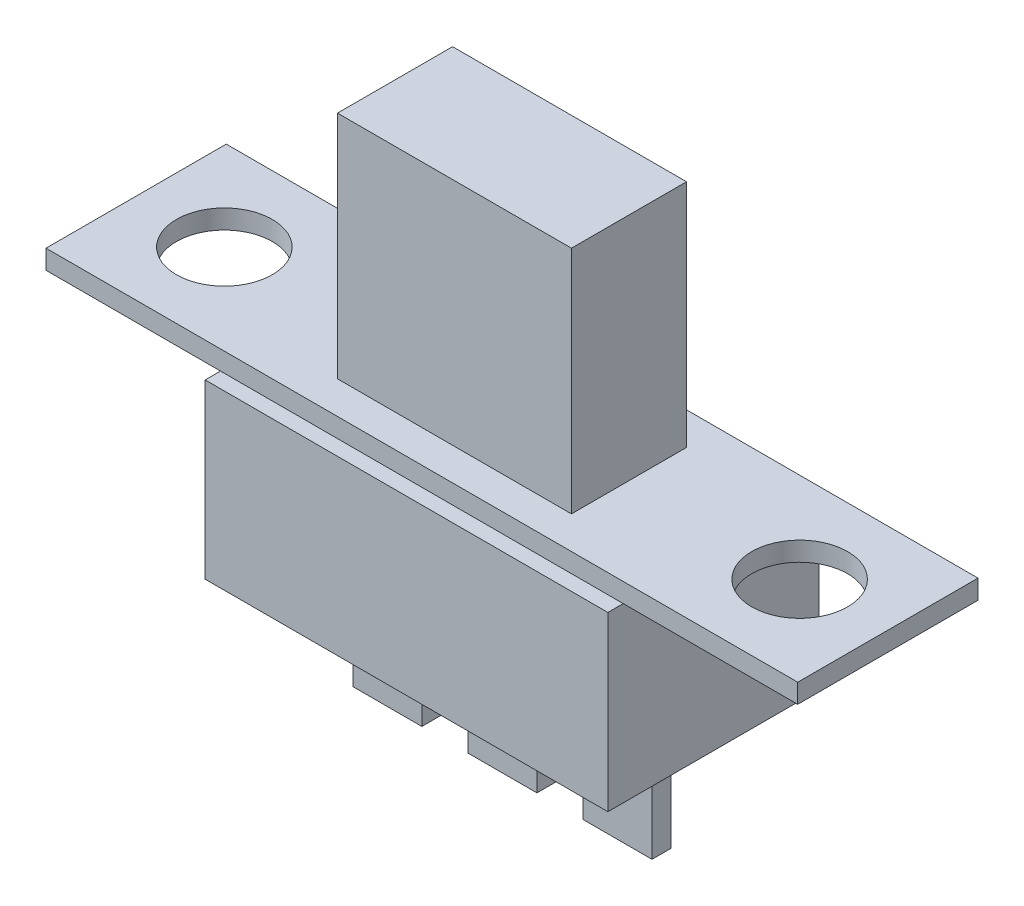
ISO-10303-21;
HEADER;
FILE_DESCRIPTION(('STEP AP214'),'2;1');
FILE_NAME('part.step','',(''),(''),'','','');
FILE_SCHEMA(('AUTOMOTIVE_DESIGN { 1 0 10303 214 1 1 1 1 }'));
ENDSEC;
DATA;
#1=APPLICATION_CONTEXT('core data for automotive mechanical design processes');
#2=APPLICATION_PROTOCOL_DEFINITION('international standard','automotive_design',2000,#1);
#3=PRODUCT_CONTEXT('',#1,'mechanical');
#4=PRODUCT('Part','Part','',(#3));
#5=PRODUCT_RELATED_PRODUCT_CATEGORY('part','',(#4));
#6=PRODUCT_DEFINITION_FORMATION('','',#4);
#7=PRODUCT_DEFINITION_CONTEXT('part definition',#1,'design');
#8=PRODUCT_DEFINITION('design','',#6,#7);
#9=PRODUCT_DEFINITION_SHAPE('','',#8);
#10=(LENGTH_UNIT() NAMED_UNIT(*) SI_UNIT(.MILLI.,.METRE.));
#11=(NAMED_UNIT(*) PLANE_ANGLE_UNIT() SI_UNIT($,.RADIAN.));
#12=(NAMED_UNIT(*) SI_UNIT($,.STERADIAN.) SOLID_ANGLE_UNIT());
#13=UNCERTAINTY_MEASURE_WITH_UNIT(LENGTH_MEASURE(1.E-05),#10,'distance_accuracy_value','');
#14=(GEOMETRIC_REPRESENTATION_CONTEXT(3) GLOBAL_UNCERTAINTY_ASSIGNED_CONTEXT((#13)) GLOBAL_UNIT_ASSIGNED_CONTEXT((#10,
#11,#12)) REPRESENTATION_CONTEXT('',''));
#15=CARTESIAN_POINT('',(0.,0.,0.));
#16=DIRECTION('',(0.,0.,1.));
#17=DIRECTION('',(1.,0.,0.));
#18=AXIS2_PLACEMENT_3D('',#15,#16,#17);
#19=CARTESIAN_POINT('',(0.,-4.5,0.));
#20=DIRECTION('',(0.,-1.,0.));
#21=DIRECTION('',(0.,0.,-1.));
#22=AXIS2_PLACEMENT_3D('',#19,#20,#21);
#23=PLANE('',#22);
#24=DIRECTION('',(0.,0.,1.));
#25=VECTOR('',#24,1.);
#26=CARTESIAN_POINT('',(-5.25,-4.5,2.75));
#27=LINE('',#26,#25);
#28=CARTESIAN_POINT('',(-5.25,-4.5,-2.75));
#29=VERTEX_POINT('',#28);
#30=CARTESIAN_POINT('',(-5.25,-4.5,2.75));
#31=VERTEX_POINT('',#30);
#32=EDGE_CURVE('E285',#29,#31,#27,.T.);
#33=ORIENTED_EDGE('',*,*,#32,.F.);
#34=DIRECTION('',(1.,0.,0.));
#35=VECTOR('',#34,1.);
#36=CARTESIAN_POINT('',(0.,-4.5,-2.75));
#37=LINE('',#36,#35);
#38=CARTESIAN_POINT('',(5.25,-4.5,-2.75));
#39=VERTEX_POINT('',#38);
#40=EDGE_CURVE('E374',#29,#39,#37,.T.);
#41=ORIENTED_EDGE('',*,*,#40,.T.);
#42=DIRECTION('',(0.,0.,1.));
#43=VECTOR('',#42,1.);
#44=CARTESIAN_POINT('',(5.25,-4.5,2.75));
#45=LINE('',#44,#43);
#46=CARTESIAN_POINT('',(5.25,-4.5,2.75));
#47=VERTEX_POINT('',#46);
#48=EDGE_CURVE('E376',#39,#47,#45,.T.);
#49=ORIENTED_EDGE('',*,*,#48,.T.);
#50=DIRECTION('',(-1.,0.,0.));
#51=VECTOR('',#50,1.);
#52=CARTESIAN_POINT('',(0.,-4.5,2.75));
#53=LINE('',#52,#51);
#54=EDGE_CURVE('E379',#47,#31,#53,.T.);
#55=ORIENTED_EDGE('',*,*,#54,.T.);
#56=EDGE_LOOP('',(#33,#41,#49,#55));
#57=FACE_BOUND('',#56,.T.);
#58=DIRECTION('',(0.,0.,1.));
#59=VECTOR('',#58,1.);
#60=CARTESIAN_POINT('',(3.9,-4.5,-0.25));
#61=LINE('',#60,#59);
#62=CARTESIAN_POINT('',(3.9,-4.5,-0.25));
#63=VERTEX_POINT('',#62);
#64=CARTESIAN_POINT('',(3.9,-4.5,0.25));
#65=VERTEX_POINT('',#64);
#66=EDGE_CURVE('E368',#63,#65,#61,.T.);
#67=ORIENTED_EDGE('',*,*,#66,.F.);
#68=DIRECTION('',(-1.,0.,0.));
#69=VECTOR('',#68,1.);
#70=CARTESIAN_POINT('',(2.1,-4.5,-0.25));
#71=LINE('',#70,#69);
#72=CARTESIAN_POINT('',(2.1,-4.5,-0.25));
#73=VERTEX_POINT('',#72);
#74=EDGE_CURVE('E362',#63,#73,#71,.T.);
#75=ORIENTED_EDGE('',*,*,#74,.T.);
#76=DIRECTION('',(0.,0.,1.));
#77=VECTOR('',#76,1.);
#78=CARTESIAN_POINT('',(2.1,-4.5,-0.25));
#79=LINE('',#78,#77);
#80=CARTESIAN_POINT('',(2.1,-4.5,0.25));
#81=VERTEX_POINT('',#80);
#82=EDGE_CURVE('E365',#73,#81,#79,.T.);
#83=ORIENTED_EDGE('',*,*,#82,.T.);
#84=DIRECTION('',(-1.,0.,0.));
#85=VECTOR('',#84,1.);
#86=CARTESIAN_POINT('',(2.1,-4.5,0.25));
#87=LINE('',#86,#85);
#88=EDGE_CURVE('E350',#65,#81,#87,.T.);
#89=ORIENTED_EDGE('',*,*,#88,.F.);
#90=EDGE_LOOP('',(#67,#75,#83,#89));
#91=FACE_BOUND('',#90,.T.);
#92=DIRECTION('',(0.,0.,1.));
#93=VECTOR('',#92,1.);
#94=CARTESIAN_POINT('',(0.9,-4.5,-0.25));
#95=LINE('',#94,#93);
#96=CARTESIAN_POINT('',(0.9,-4.5,-0.25));
#97=VERTEX_POINT('',#96);
#98=CARTESIAN_POINT('',(0.9,-4.5,0.25));
#99=VERTEX_POINT('',#98);
#100=EDGE_CURVE('E323',#97,#99,#95,.T.);
#101=ORIENTED_EDGE('',*,*,#100,.F.);
#102=DIRECTION('',(-1.,0.,0.));
#103=VECTOR('',#102,1.);
#104=CARTESIAN_POINT('',(0.,-4.5,-0.25));
#105=LINE('',#104,#103);
#106=CARTESIAN_POINT('',(-0.9,-4.5,-0.25));
#107=VERTEX_POINT('',#106);
#108=EDGE_CURVE('E322',#97,#107,#105,.T.);
#109=ORIENTED_EDGE('',*,*,#108,.T.);
#110=DIRECTION('',(0.,0.,1.));
#111=VECTOR('',#110,1.);
#112=CARTESIAN_POINT('',(-0.9,-4.5,-0.25));
#113=LINE('',#112,#111);
#114=CARTESIAN_POINT('',(-0.9,-4.5,0.25));
#115=VERTEX_POINT('',#114);
#116=EDGE_CURVE('E235',#107,#115,#113,.T.);
#117=ORIENTED_EDGE('',*,*,#116,.T.);
#118=DIRECTION('',(-1.,0.,0.));
#119=VECTOR('',#118,1.);
#120=CARTESIAN_POINT('',(0.,-4.5,0.25));
#121=LINE('',#120,#119);
#122=EDGE_CURVE('E333',#99,#115,#121,.T.);
#123=ORIENTED_EDGE('',*,*,#122,.F.);
#124=EDGE_LOOP('',(#101,#109,#117,#123));
#125=FACE_BOUND('',#124,.T.);
#126=DIRECTION('',(0.,0.,1.));
#127=VECTOR('',#126,1.);
#128=CARTESIAN_POINT('',(-3.9,-4.5,-0.25));
#129=LINE('',#128,#127);
#130=CARTESIAN_POINT('',(-3.9,-4.5,-0.25));
#131=VERTEX_POINT('',#130);
#132=CARTESIAN_POINT('',(-3.9,-4.5,0.25));
#133=VERTEX_POINT('',#132);
#134=EDGE_CURVE('E277',#131,#133,#129,.T.);
#135=ORIENTED_EDGE('',*,*,#134,.T.);
#136=DIRECTION('',(1.,0.,0.));
#137=VECTOR('',#136,1.);
#138=CARTESIAN_POINT('',(-2.1,-4.5,0.25));
#139=LINE('',#138,#137);
#140=CARTESIAN_POINT('',(-2.1,-4.5,0.25));
#141=VERTEX_POINT('',#140);
#142=EDGE_CURVE('E259',#133,#141,#139,.T.);
#143=ORIENTED_EDGE('',*,*,#142,.T.);
#144=DIRECTION('',(0.,0.,1.));
#145=VECTOR('',#144,1.);
#146=CARTESIAN_POINT('',(-2.1,-4.5,-0.25));
#147=LINE('',#146,#145);
#148=CARTESIAN_POINT('',(-2.1,-4.5,-0.25));
#149=VERTEX_POINT('',#148);
#150=EDGE_CURVE('E273',#149,#141,#147,.T.);
#151=ORIENTED_EDGE('',*,*,#150,.F.);
#152=DIRECTION('',(1.,0.,0.));
#153=VECTOR('',#152,1.);
#154=CARTESIAN_POINT('',(-2.1,-4.5,-0.25));
#155=LINE('',#154,#153);
#156=EDGE_CURVE('E269',#131,#149,#155,.T.);
#157=ORIENTED_EDGE('',*,*,#156,.F.);
#158=EDGE_LOOP('',(#135,#143,#151,#157));
#159=FACE_BOUND('',#158,.T.);
#160=ADVANCED_FACE('F39',(#57,#91,#125,#159),#23,.T.);
#161=CARTESIAN_POINT('',(0.,0.,0.));
#162=DIRECTION('',(0.,1.,0.));
#163=DIRECTION('',(0.,0.,1.));
#164=AXIS2_PLACEMENT_3D('',#161,#162,#163);
#165=PLANE('',#164);
#166=CARTESIAN_POINT('',(7.5,0.,0.));
#167=DIRECTION('',(0.,1.,0.));
#168=DIRECTION('',(0.,0.,1.));
#169=AXIS2_PLACEMENT_3D('',#166,#167,#168);
#170=CIRCLE('',#169,1.25);
#171=CARTESIAN_POINT('',(7.5,0.,1.25));
#172=VERTEX_POINT('',#171);
#173=EDGE_CURVE('E390',#172,#172,#170,.T.);
#174=ORIENTED_EDGE('',*,*,#173,.T.);
#175=EDGE_LOOP('',(#174));
#176=FACE_BOUND('',#175,.T.);
#177=DIRECTION('',(0.,0.,1.));
#178=VECTOR('',#177,1.);
#179=CARTESIAN_POINT('',(5.25,0.,2.75));
#180=LINE('',#179,#178);
#181=CARTESIAN_POINT('',(5.25,0.,-2.35));
#182=VERTEX_POINT('',#181);
#183=CARTESIAN_POINT('',(5.25,0.,2.35));
#184=VERTEX_POINT('',#183);
#185=EDGE_CURVE('E11',#182,#184,#180,.T.);
#186=ORIENTED_EDGE('',*,*,#185,.F.);
#187=DIRECTION('',(-1.,0.,0.));
#188=VECTOR('',#187,1.);
#189=CARTESIAN_POINT('',(0.,0.,-2.35));
#190=LINE('',#189,#188);
#191=CARTESIAN_POINT('',(9.8,0.,-2.35));
#192=VERTEX_POINT('',#191);
#193=EDGE_CURVE('E400',#192,#182,#190,.T.);
#194=ORIENTED_EDGE('',*,*,#193,.F.);
#195=DIRECTION('',(0.,0.,-1.));
#196=VECTOR('',#195,1.);
#197=CARTESIAN_POINT('',(9.8,0.,-2.35));
#198=LINE('',#197,#196);
#199=CARTESIAN_POINT('',(9.8,0.,2.35));
#200=VERTEX_POINT('',#199);
#201=EDGE_CURVE('E407',#200,#192,#198,.T.);
#202=ORIENTED_EDGE('',*,*,#201,.F.);
#203=DIRECTION('',(1.,0.,0.));
#204=VECTOR('',#203,1.);
#205=CARTESIAN_POINT('',(0.,0.,2.35));
#206=LINE('',#205,#204);
#207=EDGE_CURVE('E394',#184,#200,#206,.T.);
#208=ORIENTED_EDGE('',*,*,#207,.F.);
#209=EDGE_LOOP('',(#186,#194,#202,#208));
#210=FACE_BOUND('',#209,.T.);
#211=ADVANCED_FACE('F425',(#176,#210),#165,.F.);
#212=CARTESIAN_POINT('',(0.,0.5,0.));
#213=DIRECTION('',(0.,1.,0.));
#214=DIRECTION('',(0.,0.,1.));
#215=AXIS2_PLACEMENT_3D('',#212,#213,#214);
#216=PLANE('',#215);
#217=DIRECTION('',(0.,0.,1.));
#218=VECTOR('',#217,1.);
#219=CARTESIAN_POINT('',(-3.05,0.5,-1.5));
#220=LINE('',#219,#218);
#221=CARTESIAN_POINT('',(-3.05,0.5,-1.5));
#222=VERTEX_POINT('',#221);
#223=CARTESIAN_POINT('',(-3.05,0.5,1.5));
#224=VERTEX_POINT('',#223);
#225=EDGE_CURVE('E57',#222,#224,#220,.T.);
#226=ORIENTED_EDGE('',*,*,#225,.F.);
#227=DIRECTION('',(-1.,0.,0.));
#228=VECTOR('',#227,1.);
#229=CARTESIAN_POINT('',(-3.05,0.5,-1.5));
#230=LINE('',#229,#228);
#231=CARTESIAN_POINT('',(3.05,0.5,-1.5));
#232=VERTEX_POINT('',#231);
#233=EDGE_CURVE('E61',#232,#222,#230,.T.);
#234=ORIENTED_EDGE('',*,*,#233,.F.);
#235=DIRECTION('',(0.,0.,-1.));
#236=VECTOR('',#235,1.);
#237=CARTESIAN_POINT('',(3.05,0.5,-1.5));
#238=LINE('',#237,#236);
#239=CARTESIAN_POINT('',(3.05,0.5,1.5));
#240=VERTEX_POINT('',#239);
#241=EDGE_CURVE('E920',#240,#232,#238,.T.);
#242=ORIENTED_EDGE('',*,*,#241,.F.);
#243=DIRECTION('',(1.,0.,0.));
#244=VECTOR('',#243,1.);
#245=CARTESIAN_POINT('',(-3.05,0.5,1.5));
#246=LINE('',#245,#244);
#247=EDGE_CURVE('E926',#224,#240,#246,.T.);
#248=ORIENTED_EDGE('',*,*,#247,.F.);
#249=EDGE_LOOP('',(#226,#234,#242,#248));
#250=FACE_BOUND('',#249,.T.);
#251=DIRECTION('',(-1.,0.,0.));
#252=VECTOR('',#251,1.);
#253=CARTESIAN_POINT('',(0.,0.5,-2.35));
#254=LINE('',#253,#252);
#255=CARTESIAN_POINT('',(9.8,0.5,-2.35));
#256=VERTEX_POINT('',#255);
#257=CARTESIAN_POINT('',(-9.8,0.5,-2.35));
#258=VERTEX_POINT('',#257);
#259=EDGE_CURVE('E402',#256,#258,#254,.T.);
#260=ORIENTED_EDGE('',*,*,#259,.T.);
#261=DIRECTION('',(0.,0.,-1.));
#262=VECTOR('',#261,1.);
#263=CARTESIAN_POINT('',(-9.8,0.5,-2.35));
#264=LINE('',#263,#262);
#265=CARTESIAN_POINT('',(-9.8,0.5,2.35));
#266=VERTEX_POINT('',#265);
#267=EDGE_CURVE('E305',#266,#258,#264,.T.);
#268=ORIENTED_EDGE('',*,*,#267,.F.);
#269=DIRECTION('',(1.,0.,0.));
#270=VECTOR('',#269,1.);
#271=CARTESIAN_POINT('',(0.,0.5,2.35));
#272=LINE('',#271,#270);
#273=CARTESIAN_POINT('',(9.8,0.5,2.35));
#274=VERTEX_POINT('',#273);
#275=EDGE_CURVE('E397',#266,#274,#272,.T.);
#276=ORIENTED_EDGE('',*,*,#275,.T.);
#277=DIRECTION('',(0.,0.,-1.));
#278=VECTOR('',#277,1.);
#279=CARTESIAN_POINT('',(9.8,0.5,-2.35));
#280=LINE('',#279,#278);
#281=EDGE_CURVE('E399',#274,#256,#280,.T.);
#282=ORIENTED_EDGE('',*,*,#281,.T.);
#283=EDGE_LOOP('',(#260,#268,#276,#282));
#284=FACE_BOUND('',#283,.T.);
#285=CARTESIAN_POINT('',(7.5,0.5,0.));
#286=DIRECTION('',(0.,1.,0.));
#287=DIRECTION('',(0.,0.,1.));
#288=AXIS2_PLACEMENT_3D('',#285,#286,#287);
#289=CIRCLE('',#288,1.25);
#290=CARTESIAN_POINT('',(7.5,0.5,1.25));
#291=VERTEX_POINT('',#290);
#292=EDGE_CURVE('E391',#291,#291,#289,.T.);
#293=ORIENTED_EDGE('',*,*,#292,.F.);
#294=EDGE_LOOP('',(#293));
#295=FACE_BOUND('',#294,.T.);
#296=CARTESIAN_POINT('',(-7.5,0.5,0.));
#297=DIRECTION('',(0.,-1.,0.));
#298=DIRECTION('',(0.,0.,1.));
#299=AXIS2_PLACEMENT_3D('',#296,#297,#298);
#300=CIRCLE('',#299,1.25);
#301=CARTESIAN_POINT('',(-7.5,0.5,1.25));
#302=VERTEX_POINT('',#301);
#303=EDGE_CURVE('E299',#302,#302,#300,.T.);
#304=ORIENTED_EDGE('',*,*,#303,.T.);
#305=EDGE_LOOP('',(#304));
#306=FACE_BOUND('',#305,.T.);
#307=ADVANCED_FACE('F555',(#250,#284,#295,#306),#216,.T.);
#308=CARTESIAN_POINT('',(0.,0.5,2.35));
#309=DIRECTION('',(0.,0.,-1.));
#310=DIRECTION('',(-1.,0.,0.));
#311=AXIS2_PLACEMENT_3D('',#308,#309,#310);
#312=PLANE('',#311);
#313=CARTESIAN_POINT('',(-5.25,0.,2.35));
#314=VERTEX_POINT('',#313);
#315=EDGE_CURVE('E405',#314,#184,#206,.T.);
#316=ORIENTED_EDGE('',*,*,#315,.T.);
#317=ORIENTED_EDGE('',*,*,#207,.T.);
#318=DIRECTION('',(0.,-1.,0.));
#319=VECTOR('',#318,1.);
#320=CARTESIAN_POINT('',(9.8,0.5,2.35));
#321=LINE('',#320,#319);
#322=EDGE_CURVE('E43',#274,#200,#321,.T.);
#323=ORIENTED_EDGE('',*,*,#322,.F.);
#324=ORIENTED_EDGE('',*,*,#275,.F.);
#325=DIRECTION('',(0.,-1.,0.));
#326=VECTOR('',#325,1.);
#327=CARTESIAN_POINT('',(-9.8,0.5,2.35));
#328=LINE('',#327,#326);
#329=CARTESIAN_POINT('',(-9.8,0.,2.35));
#330=VERTEX_POINT('',#329);
#331=EDGE_CURVE('E318',#266,#330,#328,.T.);
#332=ORIENTED_EDGE('',*,*,#331,.T.);
#333=DIRECTION('',(-1.,0.,0.));
#334=VECTOR('',#333,1.);
#335=CARTESIAN_POINT('',(0.,0.,2.35));
#336=LINE('',#335,#334);
#337=EDGE_CURVE('E302',#314,#330,#336,.T.);
#338=ORIENTED_EDGE('',*,*,#337,.F.);
#339=EDGE_LOOP('',(#316,#317,#323,#324,#332,#338));
#340=FACE_BOUND('',#339,.T.);
#341=ADVANCED_FACE('F41',(#340),#312,.F.);
#342=CARTESIAN_POINT('',(9.8,0.5,-2.35));
#343=DIRECTION('',(-1.,0.,0.));
#344=DIRECTION('',(0.,0.,1.));
#345=AXIS2_PLACEMENT_3D('',#342,#343,#344);
#346=PLANE('',#345);
#347=ORIENTED_EDGE('',*,*,#201,.T.);
#348=DIRECTION('',(0.,-1.,0.));
#349=VECTOR('',#348,1.);
#350=CARTESIAN_POINT('',(9.8,0.5,-2.35));
#351=LINE('',#350,#349);
#352=EDGE_CURVE('E404',#256,#192,#351,.T.);
#353=ORIENTED_EDGE('',*,*,#352,.F.);
#354=ORIENTED_EDGE('',*,*,#281,.F.);
#355=ORIENTED_EDGE('',*,*,#322,.T.);
#356=EDGE_LOOP('',(#347,#353,#354,#355));
#357=FACE_BOUND('',#356,.T.);
#358=ADVANCED_FACE('F421',(#357),#346,.F.);
#359=CARTESIAN_POINT('',(0.,0.5,-2.35));
#360=DIRECTION('',(0.,0.,1.));
#361=DIRECTION('',(1.,0.,0.));
#362=AXIS2_PLACEMENT_3D('',#359,#360,#361);
#363=PLANE('',#362);
#364=ORIENTED_EDGE('',*,*,#193,.T.);
#365=CARTESIAN_POINT('',(-5.25,0.,-2.35));
#366=VERTEX_POINT('',#365);
#367=EDGE_CURVE('E409',#182,#366,#190,.T.);
#368=ORIENTED_EDGE('',*,*,#367,.T.);
#369=DIRECTION('',(1.,0.,0.));
#370=VECTOR('',#369,1.);
#371=CARTESIAN_POINT('',(0.,0.,-2.35));
#372=LINE('',#371,#370);
#373=CARTESIAN_POINT('',(-9.8,0.,-2.35));
#374=VERTEX_POINT('',#373);
#375=EDGE_CURVE('E309',#374,#366,#372,.T.);
#376=ORIENTED_EDGE('',*,*,#375,.F.);
#377=DIRECTION('',(0.,-1.,0.));
#378=VECTOR('',#377,1.);
#379=CARTESIAN_POINT('',(-9.8,0.5,-2.35));
#380=LINE('',#379,#378);
#381=EDGE_CURVE('E308',#258,#374,#380,.T.);
#382=ORIENTED_EDGE('',*,*,#381,.F.);
#383=ORIENTED_EDGE('',*,*,#259,.F.);
#384=ORIENTED_EDGE('',*,*,#352,.T.);
#385=EDGE_LOOP('',(#364,#368,#376,#382,#383,#384));
#386=FACE_BOUND('',#385,.T.);
#387=ADVANCED_FACE('F428',(#386),#363,.F.);
#388=CARTESIAN_POINT('',(7.5,0.5,0.));
#389=DIRECTION('',(0.,-1.,0.));
#390=DIRECTION('',(0.,0.,-1.));
#391=AXIS2_PLACEMENT_3D('',#388,#389,#390);
#392=CYLINDRICAL_SURFACE('',#391,1.25);
#393=ORIENTED_EDGE('',*,*,#292,.T.);
#394=EDGE_LOOP('',(#393));
#395=FACE_BOUND('',#394,.T.);
#396=ORIENTED_EDGE('',*,*,#173,.F.);
#397=EDGE_LOOP('',(#396));
#398=FACE_BOUND('',#397,.T.);
#399=ADVANCED_FACE('F551',(#395,#398),#392,.F.);
#400=CARTESIAN_POINT('',(0.,0.,0.));
#401=DIRECTION('',(0.,-1.,0.));
#402=DIRECTION('',(0.,0.,-1.));
#403=AXIS2_PLACEMENT_3D('',#400,#401,#402);
#404=PLANE('',#403);
#405=ORIENTED_EDGE('',*,*,#367,.F.);
#406=CARTESIAN_POINT('',(5.25,0.,-2.75));
#407=VERTEX_POINT('',#406);
#408=EDGE_CURVE('E49',#407,#182,#180,.T.);
#409=ORIENTED_EDGE('',*,*,#408,.F.);
#410=DIRECTION('',(1.,0.,0.));
#411=VECTOR('',#410,1.);
#412=CARTESIAN_POINT('',(0.,0.,-2.75));
#413=LINE('',#412,#411);
#414=CARTESIAN_POINT('',(-5.25,0.,-2.75));
#415=VERTEX_POINT('',#414);
#416=EDGE_CURVE('E367',#415,#407,#413,.T.);
#417=ORIENTED_EDGE('',*,*,#416,.F.);
#418=DIRECTION('',(0.,0.,1.));
#419=VECTOR('',#418,1.);
#420=CARTESIAN_POINT('',(-5.25,0.,2.75));
#421=LINE('',#420,#419);
#422=EDGE_CURVE('E289',#415,#366,#421,.T.);
#423=ORIENTED_EDGE('',*,*,#422,.T.);
#424=EDGE_LOOP('',(#405,#409,#417,#423));
#425=FACE_BOUND('',#424,.T.);
#426=ADVANCED_FACE('F432',(#425),#404,.F.);
#427=CARTESIAN_POINT('',(0.,-4.5,-2.75));
#428=DIRECTION('',(0.,0.,1.));
#429=DIRECTION('',(1.,0.,0.));
#430=AXIS2_PLACEMENT_3D('',#427,#428,#429);
#431=PLANE('',#430);
#432=ORIENTED_EDGE('',*,*,#416,.T.);
#433=DIRECTION('',(0.,1.,0.));
#434=VECTOR('',#433,1.);
#435=CARTESIAN_POINT('',(5.25,-4.5,-2.75));
#436=LINE('',#435,#434);
#437=EDGE_CURVE('E387',#39,#407,#436,.T.);
#438=ORIENTED_EDGE('',*,*,#437,.F.);
#439=ORIENTED_EDGE('',*,*,#40,.F.);
#440=DIRECTION('',(0.,1.,0.));
#441=VECTOR('',#440,1.);
#442=CARTESIAN_POINT('',(-5.25,-4.5,-2.75));
#443=LINE('',#442,#441);
#444=EDGE_CURVE('E295',#29,#415,#443,.T.);
#445=ORIENTED_EDGE('',*,*,#444,.T.);
#446=EDGE_LOOP('',(#432,#438,#439,#445));
#447=FACE_BOUND('',#446,.T.);
#448=ADVANCED_FACE('F440',(#447),#431,.F.);
#449=CARTESIAN_POINT('',(5.25,-4.5,2.75));
#450=DIRECTION('',(-1.,0.,0.));
#451=DIRECTION('',(0.,0.,1.));
#452=AXIS2_PLACEMENT_3D('',#449,#450,#451);
#453=PLANE('',#452);
#454=ORIENTED_EDGE('',*,*,#408,.T.);
#455=ORIENTED_EDGE('',*,*,#185,.T.);
#456=CARTESIAN_POINT('',(5.25,0.,2.75));
#457=VERTEX_POINT('',#456);
#458=EDGE_CURVE('E50',#184,#457,#180,.T.);
#459=ORIENTED_EDGE('',*,*,#458,.T.);
#460=DIRECTION('',(0.,1.,0.));
#461=VECTOR('',#460,1.);
#462=CARTESIAN_POINT('',(5.25,-4.5,2.75));
#463=LINE('',#462,#461);
#464=EDGE_CURVE('E381',#47,#457,#463,.T.);
#465=ORIENTED_EDGE('',*,*,#464,.F.);
#466=ORIENTED_EDGE('',*,*,#48,.F.);
#467=ORIENTED_EDGE('',*,*,#437,.T.);
#468=EDGE_LOOP('',(#454,#455,#459,#465,#466,#467));
#469=FACE_BOUND('',#468,.T.);
#470=ADVANCED_FACE('F435',(#469),#453,.F.);
#471=CARTESIAN_POINT('',(0.,-4.5,2.75));
#472=DIRECTION('',(0.,0.,-1.));
#473=DIRECTION('',(-1.,0.,0.));
#474=AXIS2_PLACEMENT_3D('',#471,#472,#473);
#475=PLANE('',#474);
#476=DIRECTION('',(-1.,0.,0.));
#477=VECTOR('',#476,1.);
#478=CARTESIAN_POINT('',(0.,0.,2.75));
#479=LINE('',#478,#477);
#480=CARTESIAN_POINT('',(-5.25,0.,2.75));
#481=VERTEX_POINT('',#480);
#482=EDGE_CURVE('E377',#457,#481,#479,.T.);
#483=ORIENTED_EDGE('',*,*,#482,.T.);
#484=DIRECTION('',(0.,1.,0.));
#485=VECTOR('',#484,1.);
#486=CARTESIAN_POINT('',(-5.25,-4.5,2.75));
#487=LINE('',#486,#485);
#488=EDGE_CURVE('E288',#31,#481,#487,.T.);
#489=ORIENTED_EDGE('',*,*,#488,.F.);
#490=ORIENTED_EDGE('',*,*,#54,.F.);
#491=ORIENTED_EDGE('',*,*,#464,.T.);
#492=EDGE_LOOP('',(#483,#489,#490,#491));
#493=FACE_BOUND('',#492,.T.);
#494=ADVANCED_FACE('F457',(#493),#475,.F.);
#495=ORIENTED_EDGE('',*,*,#315,.F.);
#496=EDGE_CURVE('E276',#314,#481,#421,.T.);
#497=ORIENTED_EDGE('',*,*,#496,.T.);
#498=ORIENTED_EDGE('',*,*,#482,.F.);
#499=ORIENTED_EDGE('',*,*,#458,.F.);
#500=EDGE_LOOP('',(#495,#497,#498,#499));
#501=FACE_BOUND('',#500,.T.);
#502=ADVANCED_FACE('F453',(#501),#404,.F.);
#503=CARTESIAN_POINT('',(2.1,-4.5,-0.25));
#504=DIRECTION('',(-1.,0.,0.));
#505=DIRECTION('',(0.,0.,1.));
#506=AXIS2_PLACEMENT_3D('',#503,#504,#505);
#507=PLANE('',#506);
#508=DIRECTION('',(0.,0.,1.));
#509=VECTOR('',#508,1.);
#510=CARTESIAN_POINT('',(2.1,-7.5,-0.25));
#511=LINE('',#510,#509);
#512=CARTESIAN_POINT('',(2.1,-7.5,-0.25));
#513=VERTEX_POINT('',#512);
#514=CARTESIAN_POINT('',(2.1,-7.5,0.25));
#515=VERTEX_POINT('',#514);
#516=EDGE_CURVE('E364',#513,#515,#511,.T.);
#517=ORIENTED_EDGE('',*,*,#516,.T.);
#518=DIRECTION('',(0.,-1.,0.));
#519=VECTOR('',#518,1.);
#520=CARTESIAN_POINT('',(2.1,-4.5,0.25));
#521=LINE('',#520,#519);
#522=EDGE_CURVE('E341',#81,#515,#521,.T.);
#523=ORIENTED_EDGE('',*,*,#522,.F.);
#524=ORIENTED_EDGE('',*,*,#82,.F.);
#525=DIRECTION('',(0.,-1.,0.));
#526=VECTOR('',#525,1.);
#527=CARTESIAN_POINT('',(2.1,-4.5,-0.25));
#528=LINE('',#527,#526);
#529=EDGE_CURVE('E353',#73,#513,#528,.T.);
#530=ORIENTED_EDGE('',*,*,#529,.T.);
#531=EDGE_LOOP('',(#517,#523,#524,#530));
#532=FACE_BOUND('',#531,.T.);
#533=ADVANCED_FACE('F535',(#532),#507,.T.);
#534=CARTESIAN_POINT('',(3.9,-4.5,-0.25));
#535=DIRECTION('',(1.,0.,0.));
#536=DIRECTION('',(0.,1.,0.));
#537=AXIS2_PLACEMENT_3D('',#534,#535,#536);
#538=PLANE('',#537);
#539=ORIENTED_EDGE('',*,*,#66,.T.);
#540=DIRECTION('',(0.,1.,0.));
#541=VECTOR('',#540,1.);
#542=CARTESIAN_POINT('',(3.9,-4.5,0.25));
#543=LINE('',#542,#541);
#544=CARTESIAN_POINT('',(3.9,-7.5,0.25));
#545=VERTEX_POINT('',#544);
#546=EDGE_CURVE('E347',#545,#65,#543,.T.);
#547=ORIENTED_EDGE('',*,*,#546,.F.);
#548=DIRECTION('',(0.,0.,1.));
#549=VECTOR('',#548,1.);
#550=CARTESIAN_POINT('',(3.9,-7.5,-0.25));
#551=LINE('',#550,#549);
#552=CARTESIAN_POINT('',(3.9,-7.5,-0.25));
#553=VERTEX_POINT('',#552);
#554=EDGE_CURVE('E371',#553,#545,#551,.T.);
#555=ORIENTED_EDGE('',*,*,#554,.F.);
#556=DIRECTION('',(0.,1.,0.));
#557=VECTOR('',#556,1.);
#558=CARTESIAN_POINT('',(3.9,-4.5,-0.25));
#559=LINE('',#558,#557);
#560=EDGE_CURVE('E359',#553,#63,#559,.T.);
#561=ORIENTED_EDGE('',*,*,#560,.T.);
#562=EDGE_LOOP('',(#539,#547,#555,#561));
#563=FACE_BOUND('',#562,.T.);
#564=ADVANCED_FACE('F532',(#563),#538,.T.);
#565=CARTESIAN_POINT('',(2.1,-7.5,-0.25));
#566=DIRECTION('',(0.,-1.,0.));
#567=DIRECTION('',(0.,0.,-1.));
#568=AXIS2_PLACEMENT_3D('',#565,#566,#567);
#569=PLANE('',#568);
#570=ORIENTED_EDGE('',*,*,#554,.T.);
#571=DIRECTION('',(1.,0.,0.));
#572=VECTOR('',#571,1.);
#573=CARTESIAN_POINT('',(2.1,-7.5,0.25));
#574=LINE('',#573,#572);
#575=EDGE_CURVE('E344',#515,#545,#574,.T.);
#576=ORIENTED_EDGE('',*,*,#575,.F.);
#577=ORIENTED_EDGE('',*,*,#516,.F.);
#578=DIRECTION('',(1.,0.,0.));
#579=VECTOR('',#578,1.);
#580=CARTESIAN_POINT('',(2.1,-7.5,-0.25));
#581=LINE('',#580,#579);
#582=EDGE_CURVE('E356',#513,#553,#581,.T.);
#583=ORIENTED_EDGE('',*,*,#582,.T.);
#584=EDGE_LOOP('',(#570,#576,#577,#583));
#585=FACE_BOUND('',#584,.T.);
#586=ADVANCED_FACE('F530',(#585),#569,.T.);
#587=CARTESIAN_POINT('',(0.,0.,-0.25));
#588=DIRECTION('',(0.,0.,1.));
#589=DIRECTION('',(1.,0.,0.));
#590=AXIS2_PLACEMENT_3D('',#587,#588,#589);
#591=PLANE('',#590);
#592=ORIENTED_EDGE('',*,*,#529,.F.);
#593=ORIENTED_EDGE('',*,*,#74,.F.);
#594=ORIENTED_EDGE('',*,*,#560,.F.);
#595=ORIENTED_EDGE('',*,*,#582,.F.);
#596=EDGE_LOOP('',(#592,#593,#594,#595));
#597=FACE_BOUND('',#596,.T.);
#598=ADVANCED_FACE('F526',(#597),#591,.F.);
#599=CARTESIAN_POINT('',(0.,0.,0.25));
#600=DIRECTION('',(0.,0.,1.));
#601=DIRECTION('',(1.,0.,0.));
#602=AXIS2_PLACEMENT_3D('',#599,#600,#601);
#603=PLANE('',#602);
#604=ORIENTED_EDGE('',*,*,#522,.T.);
#605=ORIENTED_EDGE('',*,*,#575,.T.);
#606=ORIENTED_EDGE('',*,*,#546,.T.);
#607=ORIENTED_EDGE('',*,*,#88,.T.);
#608=EDGE_LOOP('',(#604,#605,#606,#607));
#609=FACE_BOUND('',#608,.T.);
#610=ADVANCED_FACE('F516',(#609),#603,.T.);
#611=CARTESIAN_POINT('',(0.9,-4.5,-0.25));
#612=DIRECTION('',(1.,0.,0.));
#613=DIRECTION('',(0.,1.,0.));
#614=AXIS2_PLACEMENT_3D('',#611,#612,#613);
#615=PLANE('',#614);
#616=ORIENTED_EDGE('',*,*,#100,.T.);
#617=DIRECTION('',(0.,1.,0.));
#618=VECTOR('',#617,1.);
#619=CARTESIAN_POINT('',(0.9,-4.5,0.25));
#620=LINE('',#619,#618);
#621=CARTESIAN_POINT('',(0.9,-7.5,0.25));
#622=VERTEX_POINT('',#621);
#623=EDGE_CURVE('E335',#622,#99,#620,.T.);
#624=ORIENTED_EDGE('',*,*,#623,.F.);
#625=DIRECTION('',(0.,0.,1.));
#626=VECTOR('',#625,1.);
#627=CARTESIAN_POINT('',(0.9,-7.5,-0.25));
#628=LINE('',#627,#626);
#629=CARTESIAN_POINT('',(0.9,-7.5,-0.25));
#630=VERTEX_POINT('',#629);
#631=EDGE_CURVE('E320',#630,#622,#628,.T.);
#632=ORIENTED_EDGE('',*,*,#631,.F.);
#633=DIRECTION('',(0.,1.,0.));
#634=VECTOR('',#633,1.);
#635=CARTESIAN_POINT('',(0.9,-4.5,-0.25));
#636=LINE('',#635,#634);
#637=EDGE_CURVE('E327',#630,#97,#636,.T.);
#638=ORIENTED_EDGE('',*,*,#637,.T.);
#639=EDGE_LOOP('',(#616,#624,#632,#638));
#640=FACE_BOUND('',#639,.T.);
#641=ADVANCED_FACE('F512',(#640),#615,.T.);
#642=CARTESIAN_POINT('',(0.,-7.5,-0.25));
#643=DIRECTION('',(0.,-1.,0.));
#644=DIRECTION('',(0.,0.,-1.));
#645=AXIS2_PLACEMENT_3D('',#642,#643,#644);
#646=PLANE('',#645);
#647=ORIENTED_EDGE('',*,*,#631,.T.);
#648=DIRECTION('',(1.,0.,0.));
#649=VECTOR('',#648,1.);
#650=CARTESIAN_POINT('',(0.,-7.5,0.25));
#651=LINE('',#650,#649);
#652=CARTESIAN_POINT('',(-0.9,-7.5,0.25));
#653=VERTEX_POINT('',#652);
#654=EDGE_CURVE('E338',#653,#622,#651,.T.);
#655=ORIENTED_EDGE('',*,*,#654,.F.);
#656=DIRECTION('',(0.,0.,1.));
#657=VECTOR('',#656,1.);
#658=CARTESIAN_POINT('',(-0.9,-7.5,-0.25));
#659=LINE('',#658,#657);
#660=CARTESIAN_POINT('',(-0.9,-7.5,-0.25));
#661=VERTEX_POINT('',#660);
#662=EDGE_CURVE('E238',#661,#653,#659,.T.);
#663=ORIENTED_EDGE('',*,*,#662,.F.);
#664=DIRECTION('',(1.,0.,0.));
#665=VECTOR('',#664,1.);
#666=CARTESIAN_POINT('',(0.,-7.5,-0.25));
#667=LINE('',#666,#665);
#668=EDGE_CURVE('E330',#661,#630,#667,.T.);
#669=ORIENTED_EDGE('',*,*,#668,.T.);
#670=EDGE_LOOP('',(#647,#655,#663,#669));
#671=FACE_BOUND('',#670,.T.);
#672=ADVANCED_FACE('F508',(#671),#646,.T.);
#673=CARTESIAN_POINT('',(0.,0.,-0.25));
#674=DIRECTION('',(0.,0.,1.));
#675=DIRECTION('',(1.,0.,0.));
#676=AXIS2_PLACEMENT_3D('',#673,#674,#675);
#677=PLANE('',#676);
#678=ORIENTED_EDGE('',*,*,#668,.F.);
#679=DIRECTION('',(0.,1.,0.));
#680=VECTOR('',#679,1.);
#681=CARTESIAN_POINT('',(-0.9,-4.5,-0.25));
#682=LINE('',#681,#680);
#683=EDGE_CURVE('E245',#661,#107,#682,.T.);
#684=ORIENTED_EDGE('',*,*,#683,.T.);
#685=ORIENTED_EDGE('',*,*,#108,.F.);
#686=ORIENTED_EDGE('',*,*,#637,.F.);
#687=EDGE_LOOP('',(#678,#684,#685,#686));
#688=FACE_BOUND('',#687,.T.);
#689=ADVANCED_FACE('F511',(#688),#677,.F.);
#690=CARTESIAN_POINT('',(0.,0.,0.25));
#691=DIRECTION('',(0.,0.,1.));
#692=DIRECTION('',(1.,0.,0.));
#693=AXIS2_PLACEMENT_3D('',#690,#691,#692);
#694=PLANE('',#693);
#695=ORIENTED_EDGE('',*,*,#122,.T.);
#696=DIRECTION('',(0.,1.,0.));
#697=VECTOR('',#696,1.);
#698=CARTESIAN_POINT('',(-0.9,-4.5,0.25));
#699=LINE('',#698,#697);
#700=EDGE_CURVE('E249',#653,#115,#699,.T.);
#701=ORIENTED_EDGE('',*,*,#700,.F.);
#702=ORIENTED_EDGE('',*,*,#654,.T.);
#703=ORIENTED_EDGE('',*,*,#623,.T.);
#704=EDGE_LOOP('',(#695,#701,#702,#703));
#705=FACE_BOUND('',#704,.T.);
#706=ADVANCED_FACE('F503',(#705),#694,.T.);
#707=CARTESIAN_POINT('',(0.,0.,0.));
#708=DIRECTION('',(0.,1.,0.));
#709=DIRECTION('',(0.,0.,1.));
#710=AXIS2_PLACEMENT_3D('',#707,#708,#709);
#711=PLANE('',#710);
#712=CARTESIAN_POINT('',(-7.5,0.,0.));
#713=DIRECTION('',(0.,-1.,0.));
#714=DIRECTION('',(0.,0.,1.));
#715=AXIS2_PLACEMENT_3D('',#712,#713,#714);
#716=CIRCLE('',#715,1.25);
#717=CARTESIAN_POINT('',(-7.5,0.,1.25));
#718=VERTEX_POINT('',#717);
#719=EDGE_CURVE('E298',#718,#718,#716,.T.);
#720=ORIENTED_EDGE('',*,*,#719,.F.);
#721=EDGE_LOOP('',(#720));
#722=FACE_BOUND('',#721,.T.);
#723=EDGE_CURVE('E292',#366,#314,#421,.T.);
#724=ORIENTED_EDGE('',*,*,#723,.T.);
#725=ORIENTED_EDGE('',*,*,#337,.T.);
#726=DIRECTION('',(0.,0.,-1.));
#727=VECTOR('',#726,1.);
#728=CARTESIAN_POINT('',(-9.8,0.,-2.35));
#729=LINE('',#728,#727);
#730=EDGE_CURVE('E312',#330,#374,#729,.T.);
#731=ORIENTED_EDGE('',*,*,#730,.T.);
#732=ORIENTED_EDGE('',*,*,#375,.T.);
#733=EDGE_LOOP('',(#724,#725,#731,#732));
#734=FACE_BOUND('',#733,.T.);
#735=ADVANCED_FACE('F500',(#722,#734),#711,.F.);
#736=CARTESIAN_POINT('',(-9.8,0.5,-2.35));
#737=DIRECTION('',(1.,0.,0.));
#738=DIRECTION('',(0.,0.,1.));
#739=AXIS2_PLACEMENT_3D('',#736,#737,#738);
#740=PLANE('',#739);
#741=ORIENTED_EDGE('',*,*,#730,.F.);
#742=ORIENTED_EDGE('',*,*,#331,.F.);
#743=ORIENTED_EDGE('',*,*,#267,.T.);
#744=ORIENTED_EDGE('',*,*,#381,.T.);
#745=EDGE_LOOP('',(#741,#742,#743,#744));
#746=FACE_BOUND('',#745,.T.);
#747=ADVANCED_FACE('F498',(#746),#740,.F.);
#748=CARTESIAN_POINT('',(-7.5,0.5,0.));
#749=DIRECTION('',(0.,-1.,0.));
#750=DIRECTION('',(0.,0.,-1.));
#751=AXIS2_PLACEMENT_3D('',#748,#749,#750);
#752=CYLINDRICAL_SURFACE('',#751,1.25);
#753=ORIENTED_EDGE('',*,*,#303,.F.);
#754=EDGE_LOOP('',(#753));
#755=FACE_BOUND('',#754,.T.);
#756=ORIENTED_EDGE('',*,*,#719,.T.);
#757=EDGE_LOOP('',(#756));
#758=FACE_BOUND('',#757,.T.);
#759=ADVANCED_FACE('F495',(#755,#758),#752,.F.);
#760=CARTESIAN_POINT('',(-5.25,-4.5,2.75));
#761=DIRECTION('',(1.,0.,0.));
#762=DIRECTION('',(0.,0.,1.));
#763=AXIS2_PLACEMENT_3D('',#760,#761,#762);
#764=PLANE('',#763);
#765=ORIENTED_EDGE('',*,*,#422,.F.);
#766=ORIENTED_EDGE('',*,*,#444,.F.);
#767=ORIENTED_EDGE('',*,*,#32,.T.);
#768=ORIENTED_EDGE('',*,*,#488,.T.);
#769=ORIENTED_EDGE('',*,*,#496,.F.);
#770=ORIENTED_EDGE('',*,*,#723,.F.);
#771=EDGE_LOOP('',(#765,#766,#767,#768,#769,#770));
#772=FACE_BOUND('',#771,.T.);
#773=ADVANCED_FACE('F445',(#772),#764,.F.);
#774=CARTESIAN_POINT('',(-2.1,-4.5,-0.25));
#775=DIRECTION('',(1.,0.,0.));
#776=DIRECTION('',(0.,0.,1.));
#777=AXIS2_PLACEMENT_3D('',#774,#775,#776);
#778=PLANE('',#777);
#779=DIRECTION('',(0.,0.,1.));
#780=VECTOR('',#779,1.);
#781=CARTESIAN_POINT('',(-2.1,-7.5,-0.25));
#782=LINE('',#781,#780);
#783=CARTESIAN_POINT('',(-2.1,-7.5,-0.25));
#784=VERTEX_POINT('',#783);
#785=CARTESIAN_POINT('',(-2.1,-7.5,0.25));
#786=VERTEX_POINT('',#785);
#787=EDGE_CURVE('E272',#784,#786,#782,.T.);
#788=ORIENTED_EDGE('',*,*,#787,.F.);
#789=DIRECTION('',(0.,-1.,0.));
#790=VECTOR('',#789,1.);
#791=CARTESIAN_POINT('',(-2.1,-4.5,-0.25));
#792=LINE('',#791,#790);
#793=EDGE_CURVE('E262',#149,#784,#792,.T.);
#794=ORIENTED_EDGE('',*,*,#793,.F.);
#795=ORIENTED_EDGE('',*,*,#150,.T.);
#796=DIRECTION('',(0.,-1.,0.));
#797=VECTOR('',#796,1.);
#798=CARTESIAN_POINT('',(-2.1,-4.5,0.25));
#799=LINE('',#798,#797);
#800=EDGE_CURVE('E252',#141,#786,#799,.T.);
#801=ORIENTED_EDGE('',*,*,#800,.T.);
#802=EDGE_LOOP('',(#788,#794,#795,#801));
#803=FACE_BOUND('',#802,.T.);
#804=ADVANCED_FACE('F477',(#803),#778,.T.);
#805=CARTESIAN_POINT('',(-3.9,-4.5,-0.25));
#806=DIRECTION('',(-1.,0.,0.));
#807=DIRECTION('',(0.,1.,0.));
#808=AXIS2_PLACEMENT_3D('',#805,#806,#807);
#809=PLANE('',#808);
#810=ORIENTED_EDGE('',*,*,#134,.F.);
#811=DIRECTION('',(0.,1.,0.));
#812=VECTOR('',#811,1.);
#813=CARTESIAN_POINT('',(-3.9,-4.5,-0.25));
#814=LINE('',#813,#812);
#815=CARTESIAN_POINT('',(-3.9,-7.5,-0.25));
#816=VERTEX_POINT('',#815);
#817=EDGE_CURVE('E267',#816,#131,#814,.T.);
#818=ORIENTED_EDGE('',*,*,#817,.F.);
#819=DIRECTION('',(0.,0.,1.));
#820=VECTOR('',#819,1.);
#821=CARTESIAN_POINT('',(-3.9,-7.5,-0.25));
#822=LINE('',#821,#820);
#823=CARTESIAN_POINT('',(-3.9,-7.5,0.25));
#824=VERTEX_POINT('',#823);
#825=EDGE_CURVE('E280',#816,#824,#822,.T.);
#826=ORIENTED_EDGE('',*,*,#825,.T.);
#827=DIRECTION('',(0.,1.,0.));
#828=VECTOR('',#827,1.);
#829=CARTESIAN_POINT('',(-3.9,-4.5,0.25));
#830=LINE('',#829,#828);
#831=EDGE_CURVE('E257',#824,#133,#830,.T.);
#832=ORIENTED_EDGE('',*,*,#831,.T.);
#833=EDGE_LOOP('',(#810,#818,#826,#832));
#834=FACE_BOUND('',#833,.T.);
#835=ADVANCED_FACE('F470',(#834),#809,.T.);
#836=CARTESIAN_POINT('',(-2.1,-7.5,-0.25));
#837=DIRECTION('',(0.,-1.,0.));
#838=DIRECTION('',(0.,0.,-1.));
#839=AXIS2_PLACEMENT_3D('',#836,#837,#838);
#840=PLANE('',#839);
#841=ORIENTED_EDGE('',*,*,#825,.F.);
#842=DIRECTION('',(-1.,0.,0.));
#843=VECTOR('',#842,1.);
#844=CARTESIAN_POINT('',(-2.1,-7.5,-0.25));
#845=LINE('',#844,#843);
#846=EDGE_CURVE('E265',#784,#816,#845,.T.);
#847=ORIENTED_EDGE('',*,*,#846,.F.);
#848=ORIENTED_EDGE('',*,*,#787,.T.);
#849=DIRECTION('',(-1.,0.,0.));
#850=VECTOR('',#849,1.);
#851=CARTESIAN_POINT('',(-2.1,-7.5,0.25));
#852=LINE('',#851,#850);
#853=EDGE_CURVE('E255',#786,#824,#852,.T.);
#854=ORIENTED_EDGE('',*,*,#853,.T.);
#855=EDGE_LOOP('',(#841,#847,#848,#854));
#856=FACE_BOUND('',#855,.T.);
#857=ADVANCED_FACE('F481',(#856),#840,.T.);
#858=CARTESIAN_POINT('',(0.,0.,-0.25));
#859=DIRECTION('',(0.,0.,1.));
#860=DIRECTION('',(-1.,0.,0.));
#861=AXIS2_PLACEMENT_3D('',#858,#859,#860);
#862=PLANE('',#861);
#863=ORIENTED_EDGE('',*,*,#793,.T.);
#864=ORIENTED_EDGE('',*,*,#846,.T.);
#865=ORIENTED_EDGE('',*,*,#817,.T.);
#866=ORIENTED_EDGE('',*,*,#156,.T.);
#867=EDGE_LOOP('',(#863,#864,#865,#866));
#868=FACE_BOUND('',#867,.T.);
#869=ADVANCED_FACE('F479',(#868),#862,.F.);
#870=CARTESIAN_POINT('',(0.,0.,0.25));
#871=DIRECTION('',(0.,0.,1.));
#872=DIRECTION('',(-1.,0.,0.));
#873=AXIS2_PLACEMENT_3D('',#870,#871,#872);
#874=PLANE('',#873);
#875=ORIENTED_EDGE('',*,*,#800,.F.);
#876=ORIENTED_EDGE('',*,*,#142,.F.);
#877=ORIENTED_EDGE('',*,*,#831,.F.);
#878=ORIENTED_EDGE('',*,*,#853,.F.);
#879=EDGE_LOOP('',(#875,#876,#877,#878));
#880=FACE_BOUND('',#879,.T.);
#881=ADVANCED_FACE('F474',(#880),#874,.T.);
#882=CARTESIAN_POINT('',(-0.9,-4.5,-0.25));
#883=DIRECTION('',(-1.,0.,0.));
#884=DIRECTION('',(0.,1.,0.));
#885=AXIS2_PLACEMENT_3D('',#882,#883,#884);
#886=PLANE('',#885);
#887=ORIENTED_EDGE('',*,*,#116,.F.);
#888=ORIENTED_EDGE('',*,*,#683,.F.);
#889=ORIENTED_EDGE('',*,*,#662,.T.);
#890=ORIENTED_EDGE('',*,*,#700,.T.);
#891=EDGE_LOOP('',(#887,#888,#889,#890));
#892=FACE_BOUND('',#891,.T.);
#893=ADVANCED_FACE('F686',(#892),#886,.T.);
#894=CARTESIAN_POINT('',(-3.05,6.5,-1.5));
#895=DIRECTION('',(1.,0.,0.));
#896=DIRECTION('',(0.,0.,-1.));
#897=AXIS2_PLACEMENT_3D('',#894,#895,#896);
#898=PLANE('',#897);
#899=ORIENTED_EDGE('',*,*,#225,.T.);
#900=DIRECTION('',(0.,-1.,0.));
#901=VECTOR('',#900,1.);
#902=CARTESIAN_POINT('',(-3.05,6.5,1.5));
#903=LINE('',#902,#901);
#904=CARTESIAN_POINT('',(-3.05,6.5,1.5));
#905=VERTEX_POINT('',#904);
#906=EDGE_CURVE('E218',#905,#224,#903,.T.);
#907=ORIENTED_EDGE('',*,*,#906,.F.);
#908=DIRECTION('',(0.,0.,1.));
#909=VECTOR('',#908,1.);
#910=CARTESIAN_POINT('',(-3.05,6.5,-1.5));
#911=LINE('',#910,#909);
#912=CARTESIAN_POINT('',(-3.05,6.5,-1.5));
#913=VERTEX_POINT('',#912);
#914=EDGE_CURVE('E224',#913,#905,#911,.T.);
#915=ORIENTED_EDGE('',*,*,#914,.F.);
#916=DIRECTION('',(0.,-1.,0.));
#917=VECTOR('',#916,1.);
#918=CARTESIAN_POINT('',(-3.05,6.5,-1.5));
#919=LINE('',#918,#917);
#920=EDGE_CURVE('E918',#913,#222,#919,.T.);
#921=ORIENTED_EDGE('',*,*,#920,.T.);
#922=EDGE_LOOP('',(#899,#907,#915,#921));
#923=FACE_BOUND('',#922,.T.);
#924=ADVANCED_FACE('F234',(#923),#898,.F.);
#925=CARTESIAN_POINT('',(-3.05,6.5,1.5));
#926=DIRECTION('',(0.,0.,-1.));
#927=DIRECTION('',(-1.,0.,0.));
#928=AXIS2_PLACEMENT_3D('',#925,#926,#927);
#929=PLANE('',#928);
#930=ORIENTED_EDGE('',*,*,#247,.T.);
#931=DIRECTION('',(0.,-1.,0.));
#932=VECTOR('',#931,1.);
#933=CARTESIAN_POINT('',(3.05,6.5,1.5));
#934=LINE('',#933,#932);
#935=CARTESIAN_POINT('',(3.05,6.5,1.5));
#936=VERTEX_POINT('',#935);
#937=EDGE_CURVE('E220',#936,#240,#934,.T.);
#938=ORIENTED_EDGE('',*,*,#937,.F.);
#939=DIRECTION('',(1.,0.,0.));
#940=VECTOR('',#939,1.);
#941=CARTESIAN_POINT('',(-3.05,6.5,1.5));
#942=LINE('',#941,#940);
#943=EDGE_CURVE('E213',#905,#936,#942,.T.);
#944=ORIENTED_EDGE('',*,*,#943,.F.);
#945=ORIENTED_EDGE('',*,*,#906,.T.);
#946=EDGE_LOOP('',(#930,#938,#944,#945));
#947=FACE_BOUND('',#946,.T.);
#948=ADVANCED_FACE('F216',(#947),#929,.F.);
#949=CARTESIAN_POINT('',(3.05,6.5,-1.5));
#950=DIRECTION('',(-1.,0.,0.));
#951=DIRECTION('',(0.,0.,1.));
#952=AXIS2_PLACEMENT_3D('',#949,#950,#951);
#953=PLANE('',#952);
#954=ORIENTED_EDGE('',*,*,#241,.T.);
#955=DIRECTION('',(0.,-1.,0.));
#956=VECTOR('',#955,1.);
#957=CARTESIAN_POINT('',(3.05,6.5,-1.5));
#958=LINE('',#957,#956);
#959=CARTESIAN_POINT('',(3.05,6.5,-1.5));
#960=VERTEX_POINT('',#959);
#961=EDGE_CURVE('E240',#960,#232,#958,.T.);
#962=ORIENTED_EDGE('',*,*,#961,.F.);
#963=DIRECTION('',(0.,0.,-1.));
#964=VECTOR('',#963,1.);
#965=CARTESIAN_POINT('',(3.05,6.5,-1.5));
#966=LINE('',#965,#964);
#967=EDGE_CURVE('E223',#936,#960,#966,.T.);
#968=ORIENTED_EDGE('',*,*,#967,.F.);
#969=ORIENTED_EDGE('',*,*,#937,.T.);
#970=EDGE_LOOP('',(#954,#962,#968,#969));
#971=FACE_BOUND('',#970,.T.);
#972=ADVANCED_FACE('F719',(#971),#953,.F.);
#973=CARTESIAN_POINT('',(-3.05,6.5,-1.5));
#974=DIRECTION('',(0.,0.,1.));
#975=DIRECTION('',(1.,0.,0.));
#976=AXIS2_PLACEMENT_3D('',#973,#974,#975);
#977=PLANE('',#976);
#978=ORIENTED_EDGE('',*,*,#233,.T.);
#979=ORIENTED_EDGE('',*,*,#920,.F.);
#980=DIRECTION('',(-1.,0.,0.));
#981=VECTOR('',#980,1.);
#982=CARTESIAN_POINT('',(-3.05,6.5,-1.5));
#983=LINE('',#982,#981);
#984=EDGE_CURVE('E229',#960,#913,#983,.T.);
#985=ORIENTED_EDGE('',*,*,#984,.F.);
#986=ORIENTED_EDGE('',*,*,#961,.T.);
#987=EDGE_LOOP('',(#978,#979,#985,#986));
#988=FACE_BOUND('',#987,.T.);
#989=ADVANCED_FACE('F729',(#988),#977,.F.);
#990=CARTESIAN_POINT('',(0.,6.5,0.));
#991=DIRECTION('',(0.,1.,0.));
#992=DIRECTION('',(0.,0.,1.));
#993=AXIS2_PLACEMENT_3D('',#990,#991,#992);
#994=PLANE('',#993);
#995=ORIENTED_EDGE('',*,*,#914,.T.);
#996=ORIENTED_EDGE('',*,*,#943,.T.);
#997=ORIENTED_EDGE('',*,*,#967,.T.);
#998=ORIENTED_EDGE('',*,*,#984,.T.);
#999=EDGE_LOOP('',(#995,#996,#997,#998));
#1000=FACE_BOUND('',#999,.T.);
#1001=ADVANCED_FACE('F227',(#1000),#994,.T.);
#1002=CLOSED_SHELL('',(#160,#211,#307,#341,#358,#387,#399,#426,#448,#470,#494,#502,#533,#564,
#586,#598,#610,#641,#672,#689,#706,#735,#747,#759,#773,#804,#835,#857,#869,#881,#893,#924,#948,
#972,#989,#1001));
#1003=MANIFOLD_SOLID_BREP('B2',#1002);
#1004=ADVANCED_BREP_SHAPE_REPRESENTATION('',(#18,#1003),#14);
#1005=SHAPE_DEFINITION_REPRESENTATION(#9,#1004);
ENDSEC;
END-ISO-10303-21;
